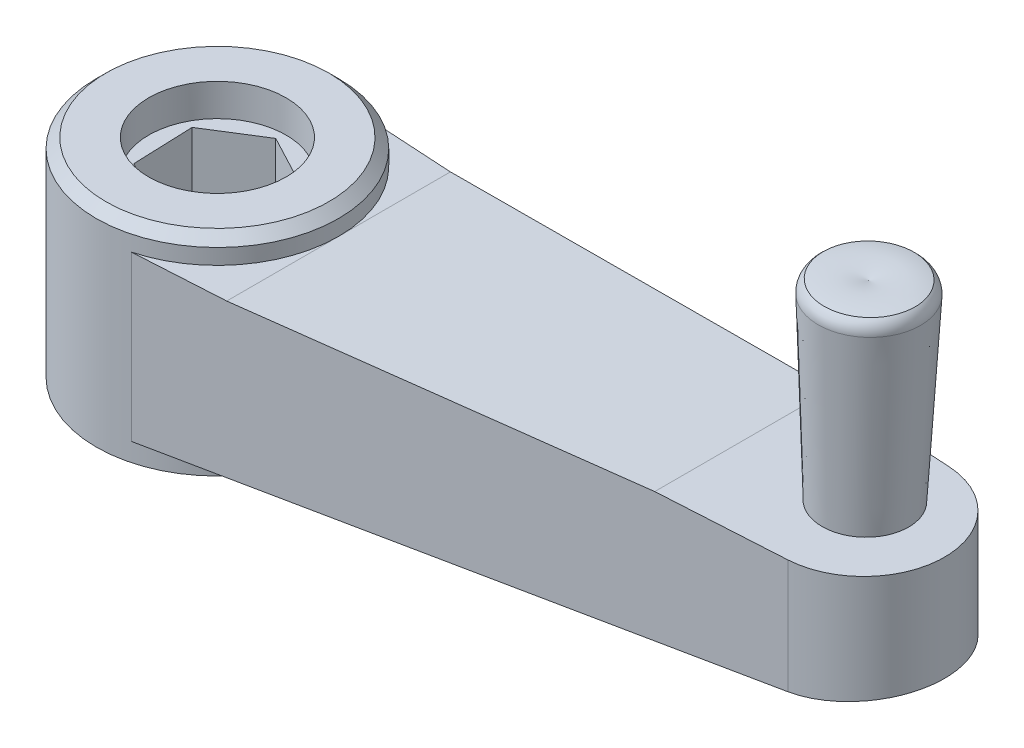
ISO-10303-21;
HEADER;
FILE_DESCRIPTION(('STEP AP214'),'2;1');
FILE_NAME('part.step','',(''),(''),'','','');
FILE_SCHEMA(('AUTOMOTIVE_DESIGN { 1 0 10303 214 1 1 1 1 }'));
ENDSEC;
DATA;
#1=APPLICATION_CONTEXT('core data for automotive mechanical design processes');
#2=APPLICATION_PROTOCOL_DEFINITION('international standard','automotive_design',2000,#1);
#3=PRODUCT_CONTEXT('',#1,'mechanical');
#4=PRODUCT('Part','Part','',(#3));
#5=PRODUCT_RELATED_PRODUCT_CATEGORY('part','',(#4));
#6=PRODUCT_DEFINITION_FORMATION('','',#4);
#7=PRODUCT_DEFINITION_CONTEXT('part definition',#1,'design');
#8=PRODUCT_DEFINITION('design','',#6,#7);
#9=PRODUCT_DEFINITION_SHAPE('','',#8);
#10=(LENGTH_UNIT() NAMED_UNIT(*) SI_UNIT(.MILLI.,.METRE.));
#11=(NAMED_UNIT(*) PLANE_ANGLE_UNIT() SI_UNIT($,.RADIAN.));
#12=(NAMED_UNIT(*) SI_UNIT($,.STERADIAN.) SOLID_ANGLE_UNIT());
#13=UNCERTAINTY_MEASURE_WITH_UNIT(LENGTH_MEASURE(1.E-05),#10,'distance_accuracy_value','');
#14=(GEOMETRIC_REPRESENTATION_CONTEXT(3) GLOBAL_UNCERTAINTY_ASSIGNED_CONTEXT((#13)) GLOBAL_UNIT_ASSIGNED_CONTEXT((#10,
#11,#12)) REPRESENTATION_CONTEXT('',''));
#15=CARTESIAN_POINT('',(0.,0.,0.));
#16=DIRECTION('',(0.,0.,1.));
#17=DIRECTION('',(1.,0.,0.));
#18=AXIS2_PLACEMENT_3D('',#15,#16,#17);
#19=CARTESIAN_POINT('',(0.,26.,0.));
#20=DIRECTION('',(0.,1.,0.));
#21=DIRECTION('',(0.,0.,1.));
#22=AXIS2_PLACEMENT_3D('',#19,#20,#21);
#23=PLANE('',#22);
#24=DIRECTION('',(0.,0.,-1.));
#25=VECTOR('',#24,1.);
#26=CARTESIAN_POINT('',(65.0291545189505,26.,0.));
#27=LINE('',#26,#25);
#28=CARTESIAN_POINT('',(65.0291545189505,26.,10.8983616176253));
#29=VERTEX_POINT('',#28);
#30=CARTESIAN_POINT('',(65.0291545189505,26.,-10.8983616176253));
#31=VERTEX_POINT('',#30);
#32=EDGE_CURVE('E245',#29,#31,#27,.T.);
#33=ORIENTED_EDGE('',*,*,#32,.F.);
#34=DIRECTION('',(0.998272727014016,0.,-0.05875));
#35=VECTOR('',#34,1.);
#36=CARTESIAN_POINT('',(0.863625,26.,14.674609087106));
#37=LINE('',#36,#35);
#38=CARTESIAN_POINT('',(80.5875,26.,9.98272727014016));
#39=VERTEX_POINT('',#38);
#40=EDGE_CURVE('E233',#29,#39,#37,.T.);
#41=ORIENTED_EDGE('',*,*,#40,.T.);
#42=CARTESIAN_POINT('',(80.,26.,0.));
#43=DIRECTION('',(0.,1.,0.));
#44=DIRECTION('',(0.,0.,1.));
#45=AXIS2_PLACEMENT_3D('',#42,#43,#44);
#46=CIRCLE('',#45,10.);
#47=CARTESIAN_POINT('',(80.5875,26.,-9.98272727014016));
#48=VERTEX_POINT('',#47);
#49=EDGE_CURVE('E236',#39,#48,#46,.T.);
#50=ORIENTED_EDGE('',*,*,#49,.T.);
#51=DIRECTION('',(-0.998272727014016,0.,-0.05875));
#52=VECTOR('',#51,1.);
#53=CARTESIAN_POINT('',(80.5875,26.,-9.98272727014016));
#54=LINE('',#53,#52);
#55=EDGE_CURVE('E239',#48,#31,#54,.T.);
#56=ORIENTED_EDGE('',*,*,#55,.T.);
#57=EDGE_LOOP('',(#33,#41,#50,#56));
#58=FACE_BOUND('',#57,.T.);
#59=CARTESIAN_POINT('',(80.1181305874292,26.,0.));
#60=DIRECTION('',(0.,1.,0.));
#61=DIRECTION('',(-1.,0.,0.));
#62=AXIS2_PLACEMENT_3D('',#59,#60,#61);
#63=ELLIPSE('',#62,2.88186941257082,2.88118920826868);
#64=CARTESIAN_POINT('',(77.2362611748584,26.,0.));
#65=VERTEX_POINT('',#64);
#66=EDGE_CURVE('E189',#65,#65,#63,.F.);
#67=ORIENTED_EDGE('',*,*,#66,.T.);
#68=EDGE_LOOP('',(#67));
#69=FACE_BOUND('',#68,.T.);
#70=ADVANCED_FACE('F33',(#58,#69),#23,.T.);
#71=CARTESIAN_POINT('',(0.,26.,0.));
#72=DIRECTION('',(0.,-1.,0.));
#73=DIRECTION('',(0.,0.,-1.));
#74=AXIS2_PLACEMENT_3D('',#71,#72,#73);
#75=PLANE('',#74);
#76=CARTESIAN_POINT('',(0.,26.,0.));
#77=DIRECTION('',(0.,1.,0.));
#78=DIRECTION('',(0.,0.,1.));
#79=AXIS2_PLACEMENT_3D('',#76,#77,#78);
#80=CIRCLE('',#79,13.8);
#81=CARTESIAN_POINT('',(0.,26.,13.8));
#82=VERTEX_POINT('',#81);
#83=EDGE_CURVE('E206',#82,#82,#80,.T.);
#84=ORIENTED_EDGE('',*,*,#83,.T.);
#85=EDGE_LOOP('',(#84));
#86=FACE_BOUND('',#85,.T.);
#87=CARTESIAN_POINT('',(0.,26.,0.));
#88=DIRECTION('',(0.,-1.,0.));
#89=DIRECTION('',(0.,0.,-1.));
#90=AXIS2_PLACEMENT_3D('',#87,#88,#89);
#91=CIRCLE('',#90,8.5);
#92=CARTESIAN_POINT('',(0.,26.,-8.5));
#93=VERTEX_POINT('',#92);
#94=EDGE_CURVE('E193',#93,#93,#91,.F.);
#95=ORIENTED_EDGE('',*,*,#94,.F.);
#96=EDGE_LOOP('',(#95));
#97=FACE_BOUND('',#96,.T.);
#98=ADVANCED_FACE('F279',(#86,#97),#75,.F.);
#99=CARTESIAN_POINT('',(80.5875,0.300000000000002,-9.98272727014016));
#100=DIRECTION('',(0.0587499999999999,0.,-0.998272727014016));
#101=DIRECTION('',(-0.998272727014016,0.,-0.0587499999999999));
#102=AXIS2_PLACEMENT_3D('',#99,#100,#101);
#103=PLANE('',#102);
#104=DIRECTION('',(0.991087002244832,0.119768536886839,0.0583271082202633));
#105=VECTOR('',#104,1.);
#106=CARTESIAN_POINT('',(79.2151578637604,11.6954904608239,-10.0634918731613));
#107=LINE('',#106,#105);
#108=CARTESIAN_POINT('',(3.84343146655537,2.58714641758488,-14.499242551316));
#109=VERTEX_POINT('',#108);
#110=CARTESIAN_POINT('',(80.5875,11.8613320159985,-9.98272727014016));
#111=VERTEX_POINT('',#110);
#112=EDGE_CURVE('E220',#109,#111,#107,.T.);
#113=ORIENTED_EDGE('',*,*,#112,.F.);
#114=DIRECTION('',(0.,1.,0.));
#115=VECTOR('',#114,1.);
#116=CARTESIAN_POINT('',(3.84343146655534,0.,-14.499242551316));
#117=LINE('',#116,#115);
#118=CARTESIAN_POINT('',(3.84343146655534,22.88,-14.499242551316));
#119=VERTEX_POINT('',#118);
#120=EDGE_CURVE('E212',#109,#119,#117,.T.);
#121=ORIENTED_EDGE('',*,*,#120,.T.);
#122=DIRECTION('',(-0.998272727014016,0.,-0.0587499999999999));
#123=VECTOR('',#122,1.);
#124=CARTESIAN_POINT('',(80.5875,22.88,-9.98272727014016));
#125=LINE('',#124,#123);
#126=CARTESIAN_POINT('',(15.0000000000001,22.88,-13.8426600527633));
#127=VERTEX_POINT('',#126);
#128=EDGE_CURVE('E230',#127,#119,#125,.T.);
#129=ORIENTED_EDGE('',*,*,#128,.F.);
#130=DIRECTION('',(-0.996343780024752,-0.0621356211906346,-0.0586364782813828));
#131=VECTOR('',#130,1.);
#132=CARTESIAN_POINT('',(78.9363848886131,26.867305457599,-10.0798981235242));
#133=LINE('',#132,#131);
#134=EDGE_CURVE('E228',#31,#127,#133,.T.);
#135=ORIENTED_EDGE('',*,*,#134,.F.);
#136=ORIENTED_EDGE('',*,*,#55,.F.);
#137=DIRECTION('',(0.,1.,0.));
#138=VECTOR('',#137,1.);
#139=CARTESIAN_POINT('',(80.5875,0.300000000000002,-9.98272727014016));
#140=LINE('',#139,#138);
#141=EDGE_CURVE('E243',#111,#48,#140,.T.);
#142=ORIENTED_EDGE('',*,*,#141,.F.);
#143=EDGE_LOOP('',(#113,#121,#129,#135,#136,#142));
#144=FACE_BOUND('',#143,.T.);
#145=ADVANCED_FACE('F285',(#144),#103,.T.);
#146=CARTESIAN_POINT('',(0.863625,0.300000000000002,14.674609087106));
#147=DIRECTION('',(0.05875,0.,0.998272727014016));
#148=DIRECTION('',(0.998272727014016,0.,-0.05875));
#149=AXIS2_PLACEMENT_3D('',#146,#147,#148);
#150=PLANE('',#149);
#151=DIRECTION('',(0.998272727014016,0.,-0.05875));
#152=VECTOR('',#151,1.);
#153=CARTESIAN_POINT('',(0.863624999999998,22.88,14.674609087106));
#154=LINE('',#153,#152);
#155=CARTESIAN_POINT('',(3.84343146655534,22.88,14.499242551316));
#156=VERTEX_POINT('',#155);
#157=CARTESIAN_POINT('',(15.0000000000001,22.88,13.8426600527633));
#158=VERTEX_POINT('',#157);
#159=EDGE_CURVE('E248',#156,#158,#154,.T.);
#160=ORIENTED_EDGE('',*,*,#159,.F.);
#161=DIRECTION('',(0.,1.,0.));
#162=VECTOR('',#161,1.);
#163=CARTESIAN_POINT('',(3.84343146655534,0.,14.499242551316));
#164=LINE('',#163,#162);
#165=CARTESIAN_POINT('',(3.84343146655533,2.58714641758487,14.499242551316));
#166=VERTEX_POINT('',#165);
#167=EDGE_CURVE('E209',#156,#166,#164,.F.);
#168=ORIENTED_EDGE('',*,*,#167,.T.);
#169=DIRECTION('',(-0.991087002244832,-0.119768536886839,0.0583271082202633));
#170=VECTOR('',#169,1.);
#171=CARTESIAN_POINT('',(0.634882182268532,2.1994072459098,14.6880709800117));
#172=LINE('',#171,#170);
#173=CARTESIAN_POINT('',(80.5875,11.8613320159985,9.98272727014016));
#174=VERTEX_POINT('',#173);
#175=EDGE_CURVE('E251',#174,#166,#172,.T.);
#176=ORIENTED_EDGE('',*,*,#175,.F.);
#177=DIRECTION('',(0.,1.,0.));
#178=VECTOR('',#177,1.);
#179=CARTESIAN_POINT('',(80.5875,0.300000000000002,9.98272727014016));
#180=LINE('',#179,#178);
#181=EDGE_CURVE('E242',#174,#39,#180,.T.);
#182=ORIENTED_EDGE('',*,*,#181,.T.);
#183=ORIENTED_EDGE('',*,*,#40,.F.);
#184=DIRECTION('',(0.996343780024752,0.0621356211906346,-0.0586364782813828));
#185=VECTOR('',#184,1.);
#186=CARTESIAN_POINT('',(-0.479689350907768,21.9146302822979,14.7536653569812));
#187=LINE('',#186,#185);
#188=EDGE_CURVE('E226',#158,#29,#187,.T.);
#189=ORIENTED_EDGE('',*,*,#188,.F.);
#190=EDGE_LOOP('',(#160,#168,#176,#182,#183,#189));
#191=FACE_BOUND('',#190,.T.);
#192=ADVANCED_FACE('F295',(#191),#150,.T.);
#193=CARTESIAN_POINT('',(-21.,22.88,-80.));
#194=DIRECTION('',(0.,-1.,0.));
#195=DIRECTION('',(1.,0.,0.));
#196=AXIS2_PLACEMENT_3D('',#193,#194,#195);
#197=PLANE('',#196);
#198=CARTESIAN_POINT('',(0.,22.88,0.));
#199=DIRECTION('',(0.,-1.,0.));
#200=DIRECTION('',(1.,0.,0.));
#201=AXIS2_PLACEMENT_3D('',#198,#199,#200);
#202=CIRCLE('',#201,15.);
#203=CARTESIAN_POINT('',(15.0000000000001,22.88,0.));
#204=VERTEX_POINT('',#203);
#205=EDGE_CURVE('E217',#204,#119,#202,.F.);
#206=ORIENTED_EDGE('',*,*,#205,.F.);
#207=DIRECTION('',(0.,0.,1.));
#208=VECTOR('',#207,1.);
#209=CARTESIAN_POINT('',(15.0000000000001,22.88,-80.));
#210=LINE('',#209,#208);
#211=EDGE_CURVE('E223',#127,#204,#210,.T.);
#212=ORIENTED_EDGE('',*,*,#211,.F.);
#213=ORIENTED_EDGE('',*,*,#128,.T.);
#214=EDGE_LOOP('',(#206,#212,#213));
#215=FACE_BOUND('',#214,.T.);
#216=ADVANCED_FACE('F291',(#215),#197,.F.);
#217=EDGE_CURVE('E214',#156,#204,#202,.F.);
#218=ORIENTED_EDGE('',*,*,#217,.F.);
#219=ORIENTED_EDGE('',*,*,#159,.T.);
#220=EDGE_CURVE('E222',#204,#158,#210,.T.);
#221=ORIENTED_EDGE('',*,*,#220,.F.);
#222=EDGE_LOOP('',(#218,#219,#221));
#223=FACE_BOUND('',#222,.T.);
#224=ADVANCED_FACE('F307',(#223),#197,.F.);
#225=CARTESIAN_POINT('',(90.01,13.,-80.));
#226=DIRECTION('',(-0.1199727875568,0.992777180562613,0.));
#227=DIRECTION('',(-0.992777180562613,-0.1199727875568,0.));
#228=AXIS2_PLACEMENT_3D('',#225,#226,#227);
#229=PLANE('',#228);
#230=CARTESIAN_POINT('',(0.,2.1226845062375,0.));
#231=DIRECTION('',(-0.1199727875568,0.992777180562613,0.));
#232=DIRECTION('',(0.992777180562613,0.1199727875568,0.));
#233=AXIS2_PLACEMENT_3D('',#230,#231,#232);
#234=ELLIPSE('',#233,15.1091305216135,15.);
#235=EDGE_CURVE('E41',#109,#166,#234,.F.);
#236=ORIENTED_EDGE('',*,*,#235,.F.);
#237=ORIENTED_EDGE('',*,*,#112,.T.);
#238=CARTESIAN_POINT('',(80.,11.7903352061708,0.));
#239=DIRECTION('',(-0.1199727875568,0.992777180562613,0.));
#240=DIRECTION('',(0.992777180562613,0.1199727875568,0.));
#241=AXIS2_PLACEMENT_3D('',#238,#239,#240);
#242=ELLIPSE('',#241,10.0727536810757,10.);
#243=EDGE_CURVE('E218',#111,#174,#242,.F.);
#244=ORIENTED_EDGE('',*,*,#243,.T.);
#245=ORIENTED_EDGE('',*,*,#175,.T.);
#246=EDGE_LOOP('',(#236,#237,#244,#245));
#247=FACE_BOUND('',#246,.T.);
#248=ADVANCED_FACE('F300',(#247),#229,.F.);
#249=CARTESIAN_POINT('',(80.,0.300000000000002,0.));
#250=DIRECTION('',(0.,1.,0.));
#251=DIRECTION('',(0.,0.,1.));
#252=AXIS2_PLACEMENT_3D('',#249,#250,#251);
#253=CYLINDRICAL_SURFACE('',#252,10.);
#254=ORIENTED_EDGE('',*,*,#243,.F.);
#255=ORIENTED_EDGE('',*,*,#141,.T.);
#256=ORIENTED_EDGE('',*,*,#49,.F.);
#257=ORIENTED_EDGE('',*,*,#181,.F.);
#258=EDGE_LOOP('',(#254,#255,#256,#257));
#259=FACE_BOUND('',#258,.T.);
#260=ADVANCED_FACE('F297',(#259),#253,.T.);
#261=CARTESIAN_POINT('',(15.0000000000001,22.88,-80.));
#262=DIRECTION('',(0.0622427159156604,-0.998061042379394,0.));
#263=DIRECTION('',(0.998061042379394,0.0622427159156604,0.));
#264=AXIS2_PLACEMENT_3D('',#261,#262,#263);
#265=PLANE('',#264);
#266=ORIENTED_EDGE('',*,*,#134,.T.);
#267=ORIENTED_EDGE('',*,*,#211,.T.);
#268=ORIENTED_EDGE('',*,*,#220,.T.);
#269=ORIENTED_EDGE('',*,*,#188,.T.);
#270=ORIENTED_EDGE('',*,*,#32,.T.);
#271=EDGE_LOOP('',(#266,#267,#268,#269,#270));
#272=FACE_BOUND('',#271,.T.);
#273=ADVANCED_FACE('F299',(#272),#265,.F.);
#274=CARTESIAN_POINT('',(0.,0.,0.));
#275=DIRECTION('',(0.,1.,0.));
#276=DIRECTION('',(0.,0.,1.));
#277=AXIS2_PLACEMENT_3D('',#274,#275,#276);
#278=CYLINDRICAL_SURFACE('',#277,15.);
#279=CARTESIAN_POINT('',(0.,0.300000000000001,0.));
#280=DIRECTION('',(0.,1.,0.));
#281=DIRECTION('',(0.,0.,1.));
#282=AXIS2_PLACEMENT_3D('',#279,#280,#281);
#283=CIRCLE('',#282,15.);
#284=CARTESIAN_POINT('',(0.,0.300000000000001,15.));
#285=VERTEX_POINT('',#284);
#286=EDGE_CURVE('E200',#285,#285,#283,.T.);
#287=ORIENTED_EDGE('',*,*,#286,.T.);
#288=EDGE_LOOP('',(#287));
#289=FACE_BOUND('',#288,.T.);
#290=CARTESIAN_POINT('',(0.,24.8,0.));
#291=DIRECTION('',(0.,1.,0.));
#292=DIRECTION('',(0.,0.,1.));
#293=AXIS2_PLACEMENT_3D('',#290,#291,#292);
#294=CIRCLE('',#293,15.);
#295=CARTESIAN_POINT('',(0.,24.8,15.));
#296=VERTEX_POINT('',#295);
#297=EDGE_CURVE('E203',#296,#296,#294,.T.);
#298=ORIENTED_EDGE('',*,*,#297,.F.);
#299=EDGE_LOOP('',(#298));
#300=FACE_BOUND('',#299,.T.);
#301=ORIENTED_EDGE('',*,*,#217,.T.);
#302=ORIENTED_EDGE('',*,*,#205,.T.);
#303=ORIENTED_EDGE('',*,*,#120,.F.);
#304=ORIENTED_EDGE('',*,*,#235,.T.);
#305=ORIENTED_EDGE('',*,*,#167,.F.);
#306=EDGE_LOOP('',(#301,#302,#303,#304,#305));
#307=FACE_BOUND('',#306,.T.);
#308=ADVANCED_FACE('F317',(#289,#300,#307),#278,.T.);
#309=CARTESIAN_POINT('',(0.,24.8,0.));
#310=DIRECTION('',(0.,-1.,0.));
#311=DIRECTION('',(0.,0.,-1.));
#312=AXIS2_PLACEMENT_3D('',#309,#310,#311);
#313=CONICAL_SURFACE('',#312,15.,0.785398163397448);
#314=ORIENTED_EDGE('',*,*,#83,.F.);
#315=EDGE_LOOP('',(#314));
#316=FACE_BOUND('',#315,.T.);
#317=ORIENTED_EDGE('',*,*,#297,.T.);
#318=EDGE_LOOP('',(#317));
#319=FACE_BOUND('',#318,.T.);
#320=ADVANCED_FACE('F343',(#316,#319),#313,.T.);
#321=CARTESIAN_POINT('',(15.,0.3,0.));
#322=DIRECTION('',(0.,1.,0.));
#323=DIRECTION('',(0.,0.,1.));
#324=AXIS2_PLACEMENT_3D('',#321,#322,#323);
#325=PLANE('',#324);
#326=ORIENTED_EDGE('',*,*,#286,.F.);
#327=EDGE_LOOP('',(#326));
#328=FACE_BOUND('',#327,.T.);
#329=CARTESIAN_POINT('',(0.,0.3,0.));
#330=DIRECTION('',(0.,1.,0.));
#331=DIRECTION('',(0.,0.,1.));
#332=AXIS2_PLACEMENT_3D('',#329,#330,#331);
#333=CIRCLE('',#332,11.);
#334=CARTESIAN_POINT('',(0.,0.3,11.));
#335=VERTEX_POINT('',#334);
#336=EDGE_CURVE('E197',#335,#335,#333,.T.);
#337=ORIENTED_EDGE('',*,*,#336,.T.);
#338=EDGE_LOOP('',(#337));
#339=FACE_BOUND('',#338,.T.);
#340=ADVANCED_FACE('F349',(#328,#339),#325,.F.);
#341=CARTESIAN_POINT('',(0.,0.,0.));
#342=DIRECTION('',(0.,1.,0.));
#343=DIRECTION('',(0.,0.,1.));
#344=AXIS2_PLACEMENT_3D('',#341,#342,#343);
#345=CYLINDRICAL_SURFACE('',#344,11.);
#346=ORIENTED_EDGE('',*,*,#336,.F.);
#347=EDGE_LOOP('',(#346));
#348=FACE_BOUND('',#347,.T.);
#349=CARTESIAN_POINT('',(0.,0.,0.));
#350=DIRECTION('',(0.,1.,0.));
#351=DIRECTION('',(0.,0.,1.));
#352=AXIS2_PLACEMENT_3D('',#349,#350,#351);
#353=CIRCLE('',#352,11.);
#354=CARTESIAN_POINT('',(0.,0.,11.));
#355=VERTEX_POINT('',#354);
#356=EDGE_CURVE('E194',#355,#355,#353,.T.);
#357=ORIENTED_EDGE('',*,*,#356,.T.);
#358=EDGE_LOOP('',(#357));
#359=FACE_BOUND('',#358,.T.);
#360=ADVANCED_FACE('F355',(#348,#359),#345,.T.);
#361=CARTESIAN_POINT('',(11.,0.,0.));
#362=DIRECTION('',(0.,1.,0.));
#363=DIRECTION('',(0.,0.,1.));
#364=AXIS2_PLACEMENT_3D('',#361,#362,#363);
#365=PLANE('',#364);
#366=DIRECTION('',(0.0370839301464436,0.,0.999312154496729));
#367=VECTOR('',#366,1.);
#368=CARTESIAN_POINT('',(-6.63469671507102,0.,-3.5091498731686));
#369=LINE('',#368,#367);
#370=CARTESIAN_POINT('',(-6.63469671507102,0.,-3.5091498731686));
#371=VERTEX_POINT('',#370);
#372=CARTESIAN_POINT('',(-6.35636129338646,0.,3.99124096507237));
#373=VERTEX_POINT('',#372);
#374=EDGE_CURVE('E136',#371,#373,#369,.T.);
#375=ORIENTED_EDGE('',*,*,#374,.T.);
#376=DIRECTION('',(0.883971677177949,0.,0.467540451669376));
#377=VECTOR('',#376,1.);
#378=CARTESIAN_POINT('',(-6.35636129338646,0.,3.99124096507237));
#379=LINE('',#378,#377);
#380=CARTESIAN_POINT('',(0.278335421684562,0.,7.50039083824096));
#381=VERTEX_POINT('',#380);
#382=EDGE_CURVE('E130',#373,#381,#379,.T.);
#383=ORIENTED_EDGE('',*,*,#382,.T.);
#384=DIRECTION('',(0.846887747031505,0.,-0.531771702827352));
#385=VECTOR('',#384,1.);
#386=CARTESIAN_POINT('',(0.278335421684562,0.,7.50039083824096));
#387=LINE('',#386,#385);
#388=CARTESIAN_POINT('',(6.63469671507102,0.,3.5091498731686));
#389=VERTEX_POINT('',#388);
#390=EDGE_CURVE('E139',#381,#389,#387,.T.);
#391=ORIENTED_EDGE('',*,*,#390,.T.);
#392=DIRECTION('',(-0.0370839301464438,0.,-0.999312154496729));
#393=VECTOR('',#392,1.);
#394=CARTESIAN_POINT('',(6.63469671507102,0.,3.5091498731686));
#395=LINE('',#394,#393);
#396=CARTESIAN_POINT('',(6.35636129338646,0.,-3.99124096507237));
#397=VERTEX_POINT('',#396);
#398=EDGE_CURVE('E48',#389,#397,#395,.T.);
#399=ORIENTED_EDGE('',*,*,#398,.T.);
#400=DIRECTION('',(-0.883971677177949,0.,-0.467540451669377));
#401=VECTOR('',#400,1.);
#402=CARTESIAN_POINT('',(6.35636129338646,0.,-3.99124096507237));
#403=LINE('',#402,#401);
#404=CARTESIAN_POINT('',(-0.27833542168456,0.,-7.50039083824096));
#405=VERTEX_POINT('',#404);
#406=EDGE_CURVE('E154',#397,#405,#403,.T.);
#407=ORIENTED_EDGE('',*,*,#406,.T.);
#408=DIRECTION('',(-0.846887747031505,0.,0.531771702827352));
#409=VECTOR('',#408,1.);
#410=CARTESIAN_POINT('',(-0.27833542168456,0.,-7.50039083824096));
#411=LINE('',#410,#409);
#412=EDGE_CURVE('E157',#405,#371,#411,.T.);
#413=ORIENTED_EDGE('',*,*,#412,.T.);
#414=EDGE_LOOP('',(#375,#383,#391,#399,#407,#413));
#415=FACE_BOUND('',#414,.T.);
#416=ORIENTED_EDGE('',*,*,#356,.F.);
#417=EDGE_LOOP('',(#416));
#418=FACE_BOUND('',#417,.T.);
#419=ADVANCED_FACE('F143',(#415,#418),#365,.F.);
#420=CARTESIAN_POINT('',(0.,22.,0.));
#421=DIRECTION('',(0.,1.,0.));
#422=DIRECTION('',(0.,0.,1.));
#423=AXIS2_PLACEMENT_3D('',#420,#421,#422);
#424=CYLINDRICAL_SURFACE('',#423,8.5);
#425=CARTESIAN_POINT('',(0.,22.,0.));
#426=DIRECTION('',(0.,1.,0.));
#427=DIRECTION('',(0.,0.,1.));
#428=AXIS2_PLACEMENT_3D('',#425,#426,#427);
#429=CIRCLE('',#428,8.5);
#430=CARTESIAN_POINT('',(0.,22.,8.5));
#431=VERTEX_POINT('',#430);
#432=EDGE_CURVE('E190',#431,#431,#429,.T.);
#433=ORIENTED_EDGE('',*,*,#432,.F.);
#434=EDGE_LOOP('',(#433));
#435=FACE_BOUND('',#434,.T.);
#436=ORIENTED_EDGE('',*,*,#94,.T.);
#437=EDGE_LOOP('',(#436));
#438=FACE_BOUND('',#437,.T.);
#439=ADVANCED_FACE('F362',(#435,#438),#424,.F.);
#440=CARTESIAN_POINT('',(8.5,22.,0.));
#441=DIRECTION('',(0.,1.,0.));
#442=DIRECTION('',(0.,0.,1.));
#443=AXIS2_PLACEMENT_3D('',#440,#441,#442);
#444=PLANE('',#443);
#445=DIRECTION('',(0.883971677177949,0.,0.467540451669376));
#446=VECTOR('',#445,1.);
#447=CARTESIAN_POINT('',(-6.35636129338646,22.,3.99124096507237));
#448=LINE('',#447,#446);
#449=CARTESIAN_POINT('',(-6.35636129338646,22.,3.99124096507237));
#450=VERTEX_POINT('',#449);
#451=CARTESIAN_POINT('',(0.278335421684562,22.,7.50039083824096));
#452=VERTEX_POINT('',#451);
#453=EDGE_CURVE('E56',#450,#452,#448,.T.);
#454=ORIENTED_EDGE('',*,*,#453,.F.);
#455=DIRECTION('',(0.0370839301464436,0.,0.999312154496729));
#456=VECTOR('',#455,1.);
#457=CARTESIAN_POINT('',(-6.63469671507102,22.,-3.5091498731686));
#458=LINE('',#457,#456);
#459=CARTESIAN_POINT('',(-6.63469671507102,22.,-3.5091498731686));
#460=VERTEX_POINT('',#459);
#461=EDGE_CURVE('E147',#460,#450,#458,.T.);
#462=ORIENTED_EDGE('',*,*,#461,.F.);
#463=DIRECTION('',(-0.846887747031505,0.,0.531771702827352));
#464=VECTOR('',#463,1.);
#465=CARTESIAN_POINT('',(-0.27833542168456,22.,-7.50039083824096));
#466=LINE('',#465,#464);
#467=CARTESIAN_POINT('',(-0.27833542168456,22.,-7.50039083824096));
#468=VERTEX_POINT('',#467);
#469=EDGE_CURVE('E150',#468,#460,#466,.T.);
#470=ORIENTED_EDGE('',*,*,#469,.F.);
#471=DIRECTION('',(-0.883971677177949,0.,-0.467540451669377));
#472=VECTOR('',#471,1.);
#473=CARTESIAN_POINT('',(6.35636129338646,22.,-3.99124096507237));
#474=LINE('',#473,#472);
#475=CARTESIAN_POINT('',(6.35636129338646,22.,-3.99124096507237));
#476=VERTEX_POINT('',#475);
#477=EDGE_CURVE('E166',#476,#468,#474,.T.);
#478=ORIENTED_EDGE('',*,*,#477,.F.);
#479=DIRECTION('',(-0.0370839301464438,0.,-0.999312154496729));
#480=VECTOR('',#479,1.);
#481=CARTESIAN_POINT('',(6.63469671507102,22.,3.5091498731686));
#482=LINE('',#481,#480);
#483=CARTESIAN_POINT('',(6.63469671507102,22.,3.5091498731686));
#484=VERTEX_POINT('',#483);
#485=EDGE_CURVE('E163',#484,#476,#482,.T.);
#486=ORIENTED_EDGE('',*,*,#485,.F.);
#487=DIRECTION('',(0.846887747031505,0.,-0.531771702827352));
#488=VECTOR('',#487,1.);
#489=CARTESIAN_POINT('',(0.278335421684562,22.,7.50039083824096));
#490=LINE('',#489,#488);
#491=EDGE_CURVE('E161',#452,#484,#490,.T.);
#492=ORIENTED_EDGE('',*,*,#491,.F.);
#493=EDGE_LOOP('',(#454,#462,#470,#478,#486,#492));
#494=FACE_BOUND('',#493,.T.);
#495=ORIENTED_EDGE('',*,*,#432,.T.);
#496=EDGE_LOOP('',(#495));
#497=FACE_BOUND('',#496,.T.);
#498=ADVANCED_FACE('F365',(#494,#497),#444,.T.);
#499=CARTESIAN_POINT('',(77.2756894678995,38.5558554976199,0.));
#500=DIRECTION('',(0.,0.,-1.));
#501=DIRECTION('',(-0.999764082524,0.0217204810016939,0.));
#502=AXIS2_PLACEMENT_3D('',#499,#500,#501);
#503=CIRCLE('',#502,12.8968253968254);
#504=TRIMMED_CURVE('',#503,(PARAMETER_VALUE(-1.81480882160338)),
(PARAMETER_VALUE(1.81480882160338)),.T.,.PARAMETER.);
#505=CARTESIAN_POINT('',(80.3908040704473,38.4881777437122,0.));
#506=DIRECTION('',(0.0217204810016939,0.999764082524,0.));
#507=AXIS1_PLACEMENT('',#505,#506);
#508=SURFACE_OF_REVOLUTION('',#504,#507);
#509=CARTESIAN_POINT('',(80.6626309967839,51.,0.));
#510=VERTEX_POINT('',#509);
#511=VERTEX_LOOP('',#510);
#512=FACE_BOUND('',#511,.T.);
#513=CARTESIAN_POINT('',(80.6653138052944,51.1234860125241,0.));
#514=DIRECTION('',(0.0217204810016939,0.999764082524,0.));
#515=DIRECTION('',(-0.999764082524,0.0217204810016939,0.));
#516=AXIS2_PLACEMENT_3D('',#513,#514,#515);
#517=CIRCLE('',#516,5.68523378991818);
#518=CARTESIAN_POINT('',(74.9814212613824,51.2469720250482,0.));
#519=VERTEX_POINT('',#518);
#520=EDGE_CURVE('E186',#519,#519,#517,.T.);
#521=ORIENTED_EDGE('',*,*,#520,.T.);
#522=EDGE_LOOP('',(#521));
#523=FACE_BOUND('',#522,.T.);
#524=ADVANCED_FACE('F274',(#512,#523),#508,.T.);
#525=CARTESIAN_POINT('',(80.1437708150272,27.1175743054753,0.));
#526=DIRECTION('',(0.0217204810016939,0.999764082524,0.));
#527=DIRECTION('',(-0.999764082524,0.0217204810016939,0.));
#528=AXIS2_PLACEMENT_3D('',#525,#526,#527);
#529=CONICAL_SURFACE('',#528,5.41306177640011,0.0443191967059719);
#530=CARTESIAN_POINT('',(80.6299652601993,49.4964407480677,0.));
#531=DIRECTION('',(-0.0217204810016939,-0.999764082524,0.));
#532=DIRECTION('',(0.999764082524,-0.0217204810016939,0.));
#533=AXIS2_PLACEMENT_3D('',#530,#531,#532);
#534=CIRCLE('',#533,6.40575923597859);
#535=CARTESIAN_POINT('',(87.0342132656271,49.3573045762813,0.));
#536=VERTEX_POINT('',#535);
#537=EDGE_CURVE('E11',#536,#536,#534,.T.);
#538=ORIENTED_EDGE('',*,*,#537,.T.);
#539=EDGE_LOOP('',(#538));
#540=FACE_BOUND('',#539,.T.);
#541=CARTESIAN_POINT('',(80.1437708150272,27.1175743054753,0.));
#542=DIRECTION('',(0.0217204810016939,0.999764082524,0.));
#543=DIRECTION('',(-0.999764082524,0.0217204810016939,0.));
#544=AXIS2_PLACEMENT_3D('',#541,#542,#543);
#545=CIRCLE('',#544,5.41306177640011);
#546=CARTESIAN_POINT('',(74.7319860744988,27.2351486109506,0.));
#547=VERTEX_POINT('',#546);
#548=EDGE_CURVE('E183',#547,#547,#545,.T.);
#549=ORIENTED_EDGE('',*,*,#548,.T.);
#550=EDGE_LOOP('',(#549));
#551=FACE_BOUND('',#550,.T.);
#552=ADVANCED_FACE('F268',(#540,#551),#529,.T.);
#553=CARTESIAN_POINT('',(80.142565156829,27.0620795048648,0.));
#554=DIRECTION('',(0.0217204810016939,0.999764082524,0.));
#555=DIRECTION('',(-0.999764082524,0.0217204810016939,0.));
#556=AXIS2_PLACEMENT_3D('',#553,#554,#555);
#557=CONICAL_SURFACE('',#556,2.85810912106099,1.54907413755165);
#558=ORIENTED_EDGE('',*,*,#548,.F.);
#559=EDGE_LOOP('',(#558));
#560=FACE_BOUND('',#559,.T.);
#561=CARTESIAN_POINT('',(80.142565156829,27.0620795048648,0.));
#562=DIRECTION('',(0.0217204810016939,0.999764082524,0.));
#563=DIRECTION('',(-0.999764082524,0.0217204810016939,0.));
#564=AXIS2_PLACEMENT_3D('',#561,#562,#563);
#565=CIRCLE('',#564,2.85810912106099);
#566=CARTESIAN_POINT('',(77.285130313658,27.1241590097295,0.));
#567=VERTEX_POINT('',#566);
#568=EDGE_CURVE('E173',#567,#567,#565,.T.);
#569=ORIENTED_EDGE('',*,*,#568,.T.);
#570=EDGE_LOOP('',(#569));
#571=FACE_BOUND('',#570,.T.);
#572=ADVANCED_FACE('F263',(#560,#571),#557,.T.);
#573=CARTESIAN_POINT('',(80.0147377092575,21.1783566336845,0.));
#574=DIRECTION('',(-0.0217204810016939,-0.999764082524,0.));
#575=DIRECTION('',(0.999764082524,-0.0217204810016939,0.));
#576=AXIS2_PLACEMENT_3D('',#573,#574,#575);
#577=CONICAL_SURFACE('',#576,2.98596673247746,0.0217221892432496);
#578=ORIENTED_EDGE('',*,*,#66,.F.);
#579=EDGE_LOOP('',(#578));
#580=FACE_BOUND('',#579,.T.);
#581=ORIENTED_EDGE('',*,*,#568,.F.);
#582=EDGE_LOOP('',(#581));
#583=FACE_BOUND('',#582,.T.);
#584=ADVANCED_FACE('F260',(#580,#583),#577,.T.);
#585=CARTESIAN_POINT('',(80.6318898985354,49.5850292227029,0.));
#586=DIRECTION('',(0.0217204810016939,0.999764082524,0.));
#587=DIRECTION('',(-0.999764082524,0.0217204810016939,0.));
#588=AXIS2_PLACEMENT_3D('',#585,#586,#587);
#589=TOROIDAL_SURFACE('',#588,4.40772310569238,2.);
#590=ORIENTED_EDGE('',*,*,#537,.F.);
#591=EDGE_LOOP('',(#590));
#592=FACE_BOUND('',#591,.T.);
#593=ORIENTED_EDGE('',*,*,#520,.F.);
#594=EDGE_LOOP('',(#593));
#595=FACE_BOUND('',#594,.T.);
#596=ADVANCED_FACE('F35',(#592,#595),#589,.T.);
#597=CARTESIAN_POINT('',(-6.35636129338646,0.,3.99124096507237));
#598=DIRECTION('',(-0.467540451669376,0.,0.883971677177949));
#599=DIRECTION('',(0.883971677177949,0.,0.467540451669376));
#600=AXIS2_PLACEMENT_3D('',#597,#598,#599);
#601=PLANE('',#600);
#602=ORIENTED_EDGE('',*,*,#453,.T.);
#603=DIRECTION('',(0.,1.,0.));
#604=VECTOR('',#603,1.);
#605=CARTESIAN_POINT('',(0.278335421684562,0.,7.50039083824096));
#606=LINE('',#605,#604);
#607=EDGE_CURVE('E126',#381,#452,#606,.T.);
#608=ORIENTED_EDGE('',*,*,#607,.F.);
#609=ORIENTED_EDGE('',*,*,#382,.F.);
#610=DIRECTION('',(0.,1.,0.));
#611=VECTOR('',#610,1.);
#612=CARTESIAN_POINT('',(-6.35636129338646,0.,3.99124096507237));
#613=LINE('',#612,#611);
#614=EDGE_CURVE('E171',#373,#450,#613,.T.);
#615=ORIENTED_EDGE('',*,*,#614,.T.);
#616=EDGE_LOOP('',(#602,#608,#609,#615));
#617=FACE_BOUND('',#616,.T.);
#618=ADVANCED_FACE('F128',(#617),#601,.F.);
#619=CARTESIAN_POINT('',(-6.63469671507102,0.,-3.5091498731686));
#620=DIRECTION('',(-0.999312154496729,0.,0.0370839301464437));
#621=DIRECTION('',(0.0370839301464437,0.,0.999312154496729));
#622=AXIS2_PLACEMENT_3D('',#619,#620,#621);
#623=PLANE('',#622);
#624=ORIENTED_EDGE('',*,*,#461,.T.);
#625=ORIENTED_EDGE('',*,*,#614,.F.);
#626=ORIENTED_EDGE('',*,*,#374,.F.);
#627=DIRECTION('',(0.,1.,0.));
#628=VECTOR('',#627,1.);
#629=CARTESIAN_POINT('',(-6.63469671507102,0.,-3.5091498731686));
#630=LINE('',#629,#628);
#631=EDGE_CURVE('E174',#371,#460,#630,.T.);
#632=ORIENTED_EDGE('',*,*,#631,.T.);
#633=EDGE_LOOP('',(#624,#625,#626,#632));
#634=FACE_BOUND('',#633,.T.);
#635=ADVANCED_FACE('F383',(#634),#623,.F.);
#636=CARTESIAN_POINT('',(-0.27833542168456,0.,-7.50039083824096));
#637=DIRECTION('',(-0.531771702827352,0.,-0.846887747031505));
#638=DIRECTION('',(-0.846887747031505,0.,0.531771702827352));
#639=AXIS2_PLACEMENT_3D('',#636,#637,#638);
#640=PLANE('',#639);
#641=ORIENTED_EDGE('',*,*,#469,.T.);
#642=ORIENTED_EDGE('',*,*,#631,.F.);
#643=ORIENTED_EDGE('',*,*,#412,.F.);
#644=DIRECTION('',(0.,1.,0.));
#645=VECTOR('',#644,1.);
#646=CARTESIAN_POINT('',(-0.27833542168456,0.,-7.50039083824096));
#647=LINE('',#646,#645);
#648=EDGE_CURVE('E176',#405,#468,#647,.T.);
#649=ORIENTED_EDGE('',*,*,#648,.T.);
#650=EDGE_LOOP('',(#641,#642,#643,#649));
#651=FACE_BOUND('',#650,.T.);
#652=ADVANCED_FACE('F390',(#651),#640,.F.);
#653=CARTESIAN_POINT('',(6.35636129338646,0.,-3.99124096507237));
#654=DIRECTION('',(0.467540451669377,0.,-0.883971677177949));
#655=DIRECTION('',(-0.883971677177949,0.,-0.467540451669377));
#656=AXIS2_PLACEMENT_3D('',#653,#654,#655);
#657=PLANE('',#656);
#658=ORIENTED_EDGE('',*,*,#477,.T.);
#659=ORIENTED_EDGE('',*,*,#648,.F.);
#660=ORIENTED_EDGE('',*,*,#406,.F.);
#661=DIRECTION('',(0.,1.,0.));
#662=VECTOR('',#661,1.);
#663=CARTESIAN_POINT('',(6.35636129338646,0.,-3.99124096507237));
#664=LINE('',#663,#662);
#665=EDGE_CURVE('E178',#397,#476,#664,.T.);
#666=ORIENTED_EDGE('',*,*,#665,.T.);
#667=EDGE_LOOP('',(#658,#659,#660,#666));
#668=FACE_BOUND('',#667,.T.);
#669=ADVANCED_FACE('F399',(#668),#657,.F.);
#670=CARTESIAN_POINT('',(6.63469671507102,0.,3.5091498731686));
#671=DIRECTION('',(0.999312154496729,0.,-0.0370839301464438));
#672=DIRECTION('',(-0.0370839301464438,0.,-0.999312154496729));
#673=AXIS2_PLACEMENT_3D('',#670,#671,#672);
#674=PLANE('',#673);
#675=ORIENTED_EDGE('',*,*,#485,.T.);
#676=ORIENTED_EDGE('',*,*,#665,.F.);
#677=ORIENTED_EDGE('',*,*,#398,.F.);
#678=DIRECTION('',(0.,1.,0.));
#679=VECTOR('',#678,1.);
#680=CARTESIAN_POINT('',(6.63469671507102,0.,3.5091498731686));
#681=LINE('',#680,#679);
#682=EDGE_CURVE('E135',#389,#484,#681,.T.);
#683=ORIENTED_EDGE('',*,*,#682,.T.);
#684=EDGE_LOOP('',(#675,#676,#677,#683));
#685=FACE_BOUND('',#684,.T.);
#686=ADVANCED_FACE('F396',(#685),#674,.F.);
#687=CARTESIAN_POINT('',(0.278335421684562,0.,7.50039083824096));
#688=DIRECTION('',(0.531771702827352,0.,0.846887747031505));
#689=DIRECTION('',(0.846887747031505,0.,-0.531771702827352));
#690=AXIS2_PLACEMENT_3D('',#687,#688,#689);
#691=PLANE('',#690);
#692=ORIENTED_EDGE('',*,*,#491,.T.);
#693=ORIENTED_EDGE('',*,*,#682,.F.);
#694=ORIENTED_EDGE('',*,*,#390,.F.);
#695=ORIENTED_EDGE('',*,*,#607,.T.);
#696=EDGE_LOOP('',(#692,#693,#694,#695));
#697=FACE_BOUND('',#696,.T.);
#698=ADVANCED_FACE('F140',(#697),#691,.F.);
#699=CLOSED_SHELL('',(#70,#98,#145,#192,#216,#224,#248,#260,#273,#308,#320,#340,#360,#419,#439,
#498,#524,#552,#572,#584,#596,#618,#635,#652,#669,#686,#698));
#700=MANIFOLD_SOLID_BREP('B2',#699);
#701=ADVANCED_BREP_SHAPE_REPRESENTATION('',(#18,#700),#14);
#702=SHAPE_DEFINITION_REPRESENTATION(#9,#701);
ENDSEC;
END-ISO-10303-21;
